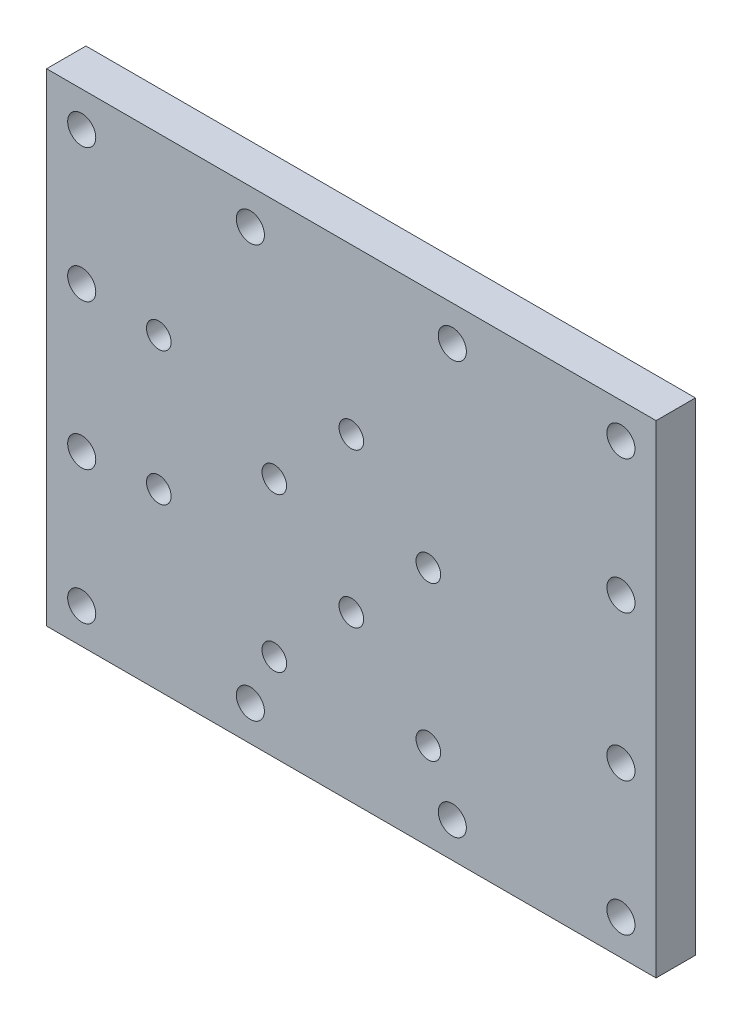
ISO-10303-21;
HEADER;
FILE_DESCRIPTION(('STEP AP214'),'2;1');
FILE_NAME('part.step','',(''),(''),'','','');
FILE_SCHEMA(('AUTOMOTIVE_DESIGN { 1 0 10303 214 1 1 1 1 }'));
ENDSEC;
DATA;
#1=APPLICATION_CONTEXT('core data for automotive mechanical design processes');
#2=APPLICATION_PROTOCOL_DEFINITION('international standard','automotive_design',2000,#1);
#3=PRODUCT_CONTEXT('',#1,'mechanical');
#4=PRODUCT('Part','Part','',(#3));
#5=PRODUCT_RELATED_PRODUCT_CATEGORY('part','',(#4));
#6=PRODUCT_DEFINITION_FORMATION('','',#4);
#7=PRODUCT_DEFINITION_CONTEXT('part definition',#1,'design');
#8=PRODUCT_DEFINITION('design','',#6,#7);
#9=PRODUCT_DEFINITION_SHAPE('','',#8);
#10=(LENGTH_UNIT() NAMED_UNIT(*) SI_UNIT(.MILLI.,.METRE.));
#11=(NAMED_UNIT(*) PLANE_ANGLE_UNIT() SI_UNIT($,.RADIAN.));
#12=(NAMED_UNIT(*) SI_UNIT($,.STERADIAN.) SOLID_ANGLE_UNIT());
#13=UNCERTAINTY_MEASURE_WITH_UNIT(LENGTH_MEASURE(1.E-05),#10,'distance_accuracy_value','');
#14=(GEOMETRIC_REPRESENTATION_CONTEXT(3) GLOBAL_UNCERTAINTY_ASSIGNED_CONTEXT((#13)) GLOBAL_UNIT_ASSIGNED_CONTEXT((#10,
#11,#12)) REPRESENTATION_CONTEXT('',''));
#15=CARTESIAN_POINT('',(0.,0.,0.));
#16=DIRECTION('',(0.,0.,1.));
#17=DIRECTION('',(1.,0.,0.));
#18=AXIS2_PLACEMENT_3D('',#15,#16,#17);
#19=CARTESIAN_POINT('',(0.,0.,3.08959499710472));
#20=DIRECTION('',(0.,0.,-1.));
#21=DIRECTION('',(-1.,0.,0.));
#22=AXIS2_PLACEMENT_3D('',#19,#20,#21);
#23=PLANE('',#22);
#24=CARTESIAN_POINT('',(-112.854312824647,49.0731544247676,3.08959499710472));
#25=DIRECTION('',(0.,0.,1.));
#26=DIRECTION('',(1.,0.,0.));
#27=AXIS2_PLACEMENT_3D('',#24,#25,#26);
#28=CIRCLE('',#27,1.75);
#29=CARTESIAN_POINT('',(-111.104312824647,49.0731544247676,3.08959499710472));
#30=VERTEX_POINT('',#29);
#31=EDGE_CURVE('E223',#30,#30,#28,.T.);
#32=ORIENTED_EDGE('',*,*,#31,.F.);
#33=EDGE_LOOP('',(#32));
#34=FACE_BOUND('',#33,.T.);
#35=CARTESIAN_POINT('',(-90.9343128246472,49.0731544247676,3.08959499710472));
#36=DIRECTION('',(0.,0.,1.));
#37=DIRECTION('',(1.,0.,0.));
#38=AXIS2_PLACEMENT_3D('',#35,#36,#37);
#39=CIRCLE('',#38,1.75);
#40=CARTESIAN_POINT('',(-89.1843128246472,49.0731544247676,3.08959499710472));
#41=VERTEX_POINT('',#40);
#42=EDGE_CURVE('E217',#41,#41,#39,.T.);
#43=ORIENTED_EDGE('',*,*,#42,.F.);
#44=EDGE_LOOP('',(#43));
#45=FACE_BOUND('',#44,.T.);
#46=CARTESIAN_POINT('',(-101.894312824647,81.9531544247676,3.08959499710472));
#47=DIRECTION('',(0.,0.,1.));
#48=DIRECTION('',(1.,0.,0.));
#49=AXIS2_PLACEMENT_3D('',#46,#47,#48);
#50=CIRCLE('',#49,1.75);
#51=CARTESIAN_POINT('',(-100.144312824647,81.9531544247676,3.08959499710472));
#52=VERTEX_POINT('',#51);
#53=EDGE_CURVE('E211',#52,#52,#50,.T.);
#54=ORIENTED_EDGE('',*,*,#53,.F.);
#55=EDGE_LOOP('',(#54));
#56=FACE_BOUND('',#55,.T.);
#57=CARTESIAN_POINT('',(-90.9343128246472,70.9931544247678,3.08959499710472));
#58=DIRECTION('',(0.,0.,1.));
#59=DIRECTION('',(1.,0.,0.));
#60=AXIS2_PLACEMENT_3D('',#57,#58,#59);
#61=CIRCLE('',#60,1.75);
#62=CARTESIAN_POINT('',(-89.1843128246472,70.9931544247678,3.08959499710472));
#63=VERTEX_POINT('',#62);
#64=EDGE_CURVE('E205',#63,#63,#61,.T.);
#65=ORIENTED_EDGE('',*,*,#64,.F.);
#66=EDGE_LOOP('',(#65));
#67=FACE_BOUND('',#66,.T.);
#68=CARTESIAN_POINT('',(-101.894312824647,60.0331544247676,3.08959499710472));
#69=DIRECTION('',(0.,0.,1.));
#70=DIRECTION('',(1.,0.,0.));
#71=AXIS2_PLACEMENT_3D('',#68,#69,#70);
#72=CIRCLE('',#71,1.75);
#73=CARTESIAN_POINT('',(-100.144312824647,60.0331544247676,3.08959499710472));
#74=VERTEX_POINT('',#73);
#75=EDGE_CURVE('E199',#74,#74,#72,.T.);
#76=ORIENTED_EDGE('',*,*,#75,.F.);
#77=EDGE_LOOP('',(#76));
#78=FACE_BOUND('',#77,.T.);
#79=CARTESIAN_POINT('',(-112.854312824647,70.9931544247678,3.08959499710472));
#80=DIRECTION('',(0.,0.,1.));
#81=DIRECTION('',(1.,0.,0.));
#82=AXIS2_PLACEMENT_3D('',#79,#80,#81);
#83=CIRCLE('',#82,1.75);
#84=CARTESIAN_POINT('',(-111.104312824647,70.9931544247678,3.08959499710472));
#85=VERTEX_POINT('',#84);
#86=EDGE_CURVE('E193',#85,#85,#83,.T.);
#87=ORIENTED_EDGE('',*,*,#86,.F.);
#88=EDGE_LOOP('',(#87));
#89=FACE_BOUND('',#88,.T.);
#90=CARTESIAN_POINT('',(-129.295243468411,61.5009786918622,3.08959499710472));
#91=DIRECTION('',(0.,0.,1.));
#92=DIRECTION('',(1.,0.,0.));
#93=AXIS2_PLACEMENT_3D('',#90,#91,#92);
#94=CIRCLE('',#93,1.75000000000001);
#95=CARTESIAN_POINT('',(-127.545243468411,61.5009786918622,3.08959499710472));
#96=VERTEX_POINT('',#95);
#97=EDGE_CURVE('E187',#96,#96,#94,.T.);
#98=ORIENTED_EDGE('',*,*,#97,.F.);
#99=EDGE_LOOP('',(#98));
#100=FACE_BOUND('',#99,.T.);
#101=CARTESIAN_POINT('',(-129.295243468411,80.4853301576721,3.08959499710472));
#102=DIRECTION('',(0.,0.,1.));
#103=DIRECTION('',(1.,0.,0.));
#104=AXIS2_PLACEMENT_3D('',#101,#102,#103);
#105=CIRCLE('',#104,1.75000000000001);
#106=CARTESIAN_POINT('',(-127.545243468411,80.4853301576721,3.08959499710472));
#107=VERTEX_POINT('',#106);
#108=EDGE_CURVE('E181',#107,#107,#105,.T.);
#109=ORIENTED_EDGE('',*,*,#108,.F.);
#110=EDGE_LOOP('',(#109));
#111=FACE_BOUND('',#110,.T.);
#112=CARTESIAN_POINT('',(-116.264312824647,100.341954424767,3.08959499710472));
#113=DIRECTION('',(0.,0.,1.));
#114=DIRECTION('',(1.,0.,0.));
#115=AXIS2_PLACEMENT_3D('',#112,#113,#114);
#116=CIRCLE('',#115,2.);
#117=CARTESIAN_POINT('',(-114.264312824647,100.341954424767,3.08959499710472));
#118=VERTEX_POINT('',#117);
#119=EDGE_CURVE('E169',#118,#118,#116,.T.);
#120=ORIENTED_EDGE('',*,*,#119,.F.);
#121=EDGE_LOOP('',(#120));
#122=FACE_BOUND('',#121,.T.);
#123=CARTESIAN_POINT('',(-140.264312824647,81.3419544247674,3.08959499710472));
#124=DIRECTION('',(0.,0.,1.));
#125=DIRECTION('',(1.,0.,0.));
#126=AXIS2_PLACEMENT_3D('',#123,#124,#125);
#127=CIRCLE('',#126,2.);
#128=CARTESIAN_POINT('',(-138.264312824647,81.3419544247674,3.08959499710472));
#129=VERTEX_POINT('',#128);
#130=EDGE_CURVE('E157',#129,#129,#127,.T.);
#131=ORIENTED_EDGE('',*,*,#130,.F.);
#132=EDGE_LOOP('',(#131));
#133=FACE_BOUND('',#132,.T.);
#134=CARTESIAN_POINT('',(-140.264312824647,41.6443544247679,3.08959499710472));
#135=DIRECTION('',(0.,0.,1.));
#136=DIRECTION('',(1.,0.,0.));
#137=AXIS2_PLACEMENT_3D('',#134,#135,#136);
#138=CIRCLE('',#137,2.);
#139=CARTESIAN_POINT('',(-138.264312824647,41.6443544247679,3.08959499710472));
#140=VERTEX_POINT('',#139);
#141=EDGE_CURVE('E145',#140,#140,#138,.T.);
#142=ORIENTED_EDGE('',*,*,#141,.F.);
#143=EDGE_LOOP('',(#142));
#144=FACE_BOUND('',#143,.T.);
#145=CARTESIAN_POINT('',(-87.5243128246472,41.6443544247679,3.08959499710472));
#146=DIRECTION('',(0.,0.,1.));
#147=DIRECTION('',(1.,0.,0.));
#148=AXIS2_PLACEMENT_3D('',#145,#146,#147);
#149=CIRCLE('',#148,2.);
#150=CARTESIAN_POINT('',(-85.5243128246472,41.6443544247679,3.08959499710472));
#151=VERTEX_POINT('',#150);
#152=EDGE_CURVE('E133',#151,#151,#149,.T.);
#153=ORIENTED_EDGE('',*,*,#152,.F.);
#154=EDGE_LOOP('',(#153));
#155=FACE_BOUND('',#154,.T.);
#156=CARTESIAN_POINT('',(-63.5243128246471,60.6443544247679,3.08959499710472));
#157=DIRECTION('',(0.,0.,1.));
#158=DIRECTION('',(1.,0.,0.));
#159=AXIS2_PLACEMENT_3D('',#156,#157,#158);
#160=CIRCLE('',#159,2.);
#161=CARTESIAN_POINT('',(-61.5243128246471,60.6443544247679,3.08959499710472));
#162=VERTEX_POINT('',#161);
#163=EDGE_CURVE('E121',#162,#162,#160,.T.);
#164=ORIENTED_EDGE('',*,*,#163,.F.);
#165=EDGE_LOOP('',(#164));
#166=FACE_BOUND('',#165,.T.);
#167=CARTESIAN_POINT('',(-63.5243128246472,100.341954424767,3.08959499710472));
#168=DIRECTION('',(0.,0.,1.));
#169=DIRECTION('',(1.,0.,0.));
#170=AXIS2_PLACEMENT_3D('',#167,#168,#169);
#171=CIRCLE('',#170,2.);
#172=CARTESIAN_POINT('',(-61.5243128246472,100.341954424767,3.08959499710472));
#173=VERTEX_POINT('',#172);
#174=EDGE_CURVE('E100',#173,#173,#171,.T.);
#175=ORIENTED_EDGE('',*,*,#174,.F.);
#176=EDGE_LOOP('',(#175));
#177=FACE_BOUND('',#176,.T.);
#178=DIRECTION('',(0.,-1.,0.));
#179=VECTOR('',#178,1.);
#180=CARTESIAN_POINT('',(-145.264312824647,36.6443544247679,3.08959499710472));
#181=LINE('',#180,#179);
#182=CARTESIAN_POINT('',(-145.264312824647,105.341954424767,3.08959499710472));
#183=VERTEX_POINT('',#182);
#184=CARTESIAN_POINT('',(-145.264312824647,36.6443544247679,3.08959499710472));
#185=VERTEX_POINT('',#184);
#186=EDGE_CURVE('E85',#183,#185,#181,.T.);
#187=ORIENTED_EDGE('',*,*,#186,.T.);
#188=DIRECTION('',(1.,0.,0.));
#189=VECTOR('',#188,1.);
#190=CARTESIAN_POINT('',(-145.264312824647,36.6443544247679,3.08959499710472));
#191=LINE('',#190,#189);
#192=CARTESIAN_POINT('',(-58.5243128246472,36.6443544247679,3.08959499710472));
#193=VERTEX_POINT('',#192);
#194=EDGE_CURVE('E80',#185,#193,#191,.T.);
#195=ORIENTED_EDGE('',*,*,#194,.T.);
#196=DIRECTION('',(0.,1.,0.));
#197=VECTOR('',#196,1.);
#198=CARTESIAN_POINT('',(-58.5243128246472,36.6443544247679,3.08959499710472));
#199=LINE('',#198,#197);
#200=CARTESIAN_POINT('',(-58.5243128246472,105.341954424767,3.08959499710472));
#201=VERTEX_POINT('',#200);
#202=EDGE_CURVE('E83',#193,#201,#199,.T.);
#203=ORIENTED_EDGE('',*,*,#202,.T.);
#204=DIRECTION('',(-1.,0.,0.));
#205=VECTOR('',#204,1.);
#206=CARTESIAN_POINT('',(-145.264312824647,105.341954424767,3.08959499710472));
#207=LINE('',#206,#205);
#208=EDGE_CURVE('E50',#201,#183,#207,.T.);
#209=ORIENTED_EDGE('',*,*,#208,.T.);
#210=EDGE_LOOP('',(#187,#195,#203,#209));
#211=FACE_BOUND('',#210,.T.);
#212=CARTESIAN_POINT('',(-63.5243128246471,81.3419544247674,3.08959499710472));
#213=DIRECTION('',(0.,0.,1.));
#214=DIRECTION('',(1.,0.,0.));
#215=AXIS2_PLACEMENT_3D('',#212,#213,#214);
#216=CIRCLE('',#215,2.);
#217=CARTESIAN_POINT('',(-61.5243128246471,81.3419544247674,3.08959499710472));
#218=VERTEX_POINT('',#217);
#219=EDGE_CURVE('E115',#218,#218,#216,.T.);
#220=ORIENTED_EDGE('',*,*,#219,.F.);
#221=EDGE_LOOP('',(#220));
#222=FACE_BOUND('',#221,.T.);
#223=CARTESIAN_POINT('',(-63.5243128246472,41.6443544247679,3.08959499710472));
#224=DIRECTION('',(0.,0.,1.));
#225=DIRECTION('',(1.,0.,0.));
#226=AXIS2_PLACEMENT_3D('',#223,#224,#225);
#227=CIRCLE('',#226,2.);
#228=CARTESIAN_POINT('',(-61.5243128246472,41.6443544247679,3.08959499710472));
#229=VERTEX_POINT('',#228);
#230=EDGE_CURVE('E127',#229,#229,#227,.T.);
#231=ORIENTED_EDGE('',*,*,#230,.F.);
#232=EDGE_LOOP('',(#231));
#233=FACE_BOUND('',#232,.T.);
#234=CARTESIAN_POINT('',(-116.264312824647,41.6443544247679,3.08959499710472));
#235=DIRECTION('',(0.,0.,1.));
#236=DIRECTION('',(1.,0.,0.));
#237=AXIS2_PLACEMENT_3D('',#234,#235,#236);
#238=CIRCLE('',#237,2.);
#239=CARTESIAN_POINT('',(-114.264312824647,41.6443544247679,3.08959499710472));
#240=VERTEX_POINT('',#239);
#241=EDGE_CURVE('E139',#240,#240,#238,.T.);
#242=ORIENTED_EDGE('',*,*,#241,.F.);
#243=EDGE_LOOP('',(#242));
#244=FACE_BOUND('',#243,.T.);
#245=CARTESIAN_POINT('',(-140.264312824647,60.6443544247679,3.08959499710472));
#246=DIRECTION('',(0.,0.,1.));
#247=DIRECTION('',(1.,0.,0.));
#248=AXIS2_PLACEMENT_3D('',#245,#246,#247);
#249=CIRCLE('',#248,2.);
#250=CARTESIAN_POINT('',(-138.264312824647,60.6443544247679,3.08959499710472));
#251=VERTEX_POINT('',#250);
#252=EDGE_CURVE('E151',#251,#251,#249,.T.);
#253=ORIENTED_EDGE('',*,*,#252,.F.);
#254=EDGE_LOOP('',(#253));
#255=FACE_BOUND('',#254,.T.);
#256=CARTESIAN_POINT('',(-140.264312824647,100.341954424767,3.08959499710472));
#257=DIRECTION('',(0.,0.,1.));
#258=DIRECTION('',(1.,0.,0.));
#259=AXIS2_PLACEMENT_3D('',#256,#257,#258);
#260=CIRCLE('',#259,2.);
#261=CARTESIAN_POINT('',(-138.264312824647,100.341954424767,3.08959499710472));
#262=VERTEX_POINT('',#261);
#263=EDGE_CURVE('E163',#262,#262,#260,.T.);
#264=ORIENTED_EDGE('',*,*,#263,.F.);
#265=EDGE_LOOP('',(#264));
#266=FACE_BOUND('',#265,.T.);
#267=CARTESIAN_POINT('',(-87.5243128246472,100.341954424767,3.08959499710472));
#268=DIRECTION('',(0.,0.,1.));
#269=DIRECTION('',(1.,0.,0.));
#270=AXIS2_PLACEMENT_3D('',#267,#268,#269);
#271=CIRCLE('',#270,2.);
#272=CARTESIAN_POINT('',(-85.5243128246472,100.341954424767,3.08959499710472));
#273=VERTEX_POINT('',#272);
#274=EDGE_CURVE('E175',#273,#273,#271,.T.);
#275=ORIENTED_EDGE('',*,*,#274,.F.);
#276=EDGE_LOOP('',(#275));
#277=FACE_BOUND('',#276,.T.);
#278=ADVANCED_FACE('F33',(#34,#45,#56,#67,#78,#89,#100,#111,#122,#133,#144,#155,#166,#177,#211,
#222,#233,#244,#255,#266,#277),#23,.F.);
#279=CARTESIAN_POINT('',(0.,0.,-2.51040500289528));
#280=DIRECTION('',(0.,0.,-1.));
#281=DIRECTION('',(-1.,0.,0.));
#282=AXIS2_PLACEMENT_3D('',#279,#280,#281);
#283=PLANE('',#282);
#284=CARTESIAN_POINT('',(-112.854312824647,49.0731544247676,-2.51040500289528));
#285=DIRECTION('',(0.,0.,-1.));
#286=DIRECTION('',(-1.,0.,0.));
#287=AXIS2_PLACEMENT_3D('',#284,#285,#286);
#288=CIRCLE('',#287,1.75);
#289=CARTESIAN_POINT('',(-114.604312824647,49.0731544247676,-2.51040500289528));
#290=VERTEX_POINT('',#289);
#291=EDGE_CURVE('E226',#290,#290,#288,.F.);
#292=ORIENTED_EDGE('',*,*,#291,.T.);
#293=EDGE_LOOP('',(#292));
#294=FACE_BOUND('',#293,.T.);
#295=CARTESIAN_POINT('',(-90.9343128246472,49.0731544247676,-2.51040500289528));
#296=DIRECTION('',(0.,0.,-1.));
#297=DIRECTION('',(-1.,0.,0.));
#298=AXIS2_PLACEMENT_3D('',#295,#296,#297);
#299=CIRCLE('',#298,1.75);
#300=CARTESIAN_POINT('',(-92.6843128246472,49.0731544247676,-2.51040500289528));
#301=VERTEX_POINT('',#300);
#302=EDGE_CURVE('E220',#301,#301,#299,.F.);
#303=ORIENTED_EDGE('',*,*,#302,.T.);
#304=EDGE_LOOP('',(#303));
#305=FACE_BOUND('',#304,.T.);
#306=CARTESIAN_POINT('',(-101.894312824647,81.9531544247676,-2.51040500289528));
#307=DIRECTION('',(0.,0.,-1.));
#308=DIRECTION('',(-1.,0.,0.));
#309=AXIS2_PLACEMENT_3D('',#306,#307,#308);
#310=CIRCLE('',#309,1.75);
#311=CARTESIAN_POINT('',(-103.644312824647,81.9531544247676,-2.51040500289528));
#312=VERTEX_POINT('',#311);
#313=EDGE_CURVE('E214',#312,#312,#310,.F.);
#314=ORIENTED_EDGE('',*,*,#313,.T.);
#315=EDGE_LOOP('',(#314));
#316=FACE_BOUND('',#315,.T.);
#317=CARTESIAN_POINT('',(-90.9343128246472,70.9931544247678,-2.51040500289528));
#318=DIRECTION('',(0.,0.,-1.));
#319=DIRECTION('',(-1.,0.,0.));
#320=AXIS2_PLACEMENT_3D('',#317,#318,#319);
#321=CIRCLE('',#320,1.75);
#322=CARTESIAN_POINT('',(-92.6843128246472,70.9931544247678,-2.51040500289528));
#323=VERTEX_POINT('',#322);
#324=EDGE_CURVE('E208',#323,#323,#321,.F.);
#325=ORIENTED_EDGE('',*,*,#324,.T.);
#326=EDGE_LOOP('',(#325));
#327=FACE_BOUND('',#326,.T.);
#328=CARTESIAN_POINT('',(-101.894312824647,60.0331544247676,-2.51040500289528));
#329=DIRECTION('',(0.,0.,-1.));
#330=DIRECTION('',(-1.,0.,0.));
#331=AXIS2_PLACEMENT_3D('',#328,#329,#330);
#332=CIRCLE('',#331,1.75);
#333=CARTESIAN_POINT('',(-103.644312824647,60.0331544247676,-2.51040500289528));
#334=VERTEX_POINT('',#333);
#335=EDGE_CURVE('E202',#334,#334,#332,.F.);
#336=ORIENTED_EDGE('',*,*,#335,.T.);
#337=EDGE_LOOP('',(#336));
#338=FACE_BOUND('',#337,.T.);
#339=CARTESIAN_POINT('',(-112.854312824647,70.9931544247678,-2.51040500289528));
#340=DIRECTION('',(0.,0.,-1.));
#341=DIRECTION('',(-1.,0.,0.));
#342=AXIS2_PLACEMENT_3D('',#339,#340,#341);
#343=CIRCLE('',#342,1.75);
#344=CARTESIAN_POINT('',(-114.604312824647,70.9931544247678,-2.51040500289528));
#345=VERTEX_POINT('',#344);
#346=EDGE_CURVE('E196',#345,#345,#343,.F.);
#347=ORIENTED_EDGE('',*,*,#346,.T.);
#348=EDGE_LOOP('',(#347));
#349=FACE_BOUND('',#348,.T.);
#350=CARTESIAN_POINT('',(-129.295243468411,61.5009786918622,-2.51040500289528));
#351=DIRECTION('',(0.,0.,-1.));
#352=DIRECTION('',(-1.,0.,0.));
#353=AXIS2_PLACEMENT_3D('',#350,#351,#352);
#354=CIRCLE('',#353,1.75000000000001);
#355=CARTESIAN_POINT('',(-131.045243468411,61.5009786918622,-2.51040500289528));
#356=VERTEX_POINT('',#355);
#357=EDGE_CURVE('E190',#356,#356,#354,.F.);
#358=ORIENTED_EDGE('',*,*,#357,.T.);
#359=EDGE_LOOP('',(#358));
#360=FACE_BOUND('',#359,.T.);
#361=CARTESIAN_POINT('',(-129.295243468411,80.4853301576721,-2.51040500289528));
#362=DIRECTION('',(0.,0.,-1.));
#363=DIRECTION('',(-1.,0.,0.));
#364=AXIS2_PLACEMENT_3D('',#361,#362,#363);
#365=CIRCLE('',#364,1.75000000000001);
#366=CARTESIAN_POINT('',(-131.045243468411,80.4853301576721,-2.51040500289528));
#367=VERTEX_POINT('',#366);
#368=EDGE_CURVE('E184',#367,#367,#365,.F.);
#369=ORIENTED_EDGE('',*,*,#368,.T.);
#370=EDGE_LOOP('',(#369));
#371=FACE_BOUND('',#370,.T.);
#372=CARTESIAN_POINT('',(-116.264312824647,100.341954424767,-2.51040500289528));
#373=DIRECTION('',(0.,0.,1.));
#374=DIRECTION('',(1.,0.,0.));
#375=AXIS2_PLACEMENT_3D('',#372,#373,#374);
#376=CIRCLE('',#375,2.);
#377=CARTESIAN_POINT('',(-114.264312824647,100.341954424767,-2.51040500289528));
#378=VERTEX_POINT('',#377);
#379=EDGE_CURVE('E172',#378,#378,#376,.T.);
#380=ORIENTED_EDGE('',*,*,#379,.T.);
#381=EDGE_LOOP('',(#380));
#382=FACE_BOUND('',#381,.T.);
#383=CARTESIAN_POINT('',(-140.264312824647,81.3419544247674,-2.51040500289528));
#384=DIRECTION('',(0.,0.,1.));
#385=DIRECTION('',(1.,0.,0.));
#386=AXIS2_PLACEMENT_3D('',#383,#384,#385);
#387=CIRCLE('',#386,2.);
#388=CARTESIAN_POINT('',(-138.264312824647,81.3419544247674,-2.51040500289528));
#389=VERTEX_POINT('',#388);
#390=EDGE_CURVE('E160',#389,#389,#387,.T.);
#391=ORIENTED_EDGE('',*,*,#390,.T.);
#392=EDGE_LOOP('',(#391));
#393=FACE_BOUND('',#392,.T.);
#394=CARTESIAN_POINT('',(-140.264312824647,41.6443544247679,-2.51040500289528));
#395=DIRECTION('',(0.,0.,1.));
#396=DIRECTION('',(1.,0.,0.));
#397=AXIS2_PLACEMENT_3D('',#394,#395,#396);
#398=CIRCLE('',#397,2.);
#399=CARTESIAN_POINT('',(-138.264312824647,41.6443544247679,-2.51040500289528));
#400=VERTEX_POINT('',#399);
#401=EDGE_CURVE('E148',#400,#400,#398,.T.);
#402=ORIENTED_EDGE('',*,*,#401,.T.);
#403=EDGE_LOOP('',(#402));
#404=FACE_BOUND('',#403,.T.);
#405=CARTESIAN_POINT('',(-87.5243128246472,41.6443544247679,-2.51040500289528));
#406=DIRECTION('',(0.,0.,1.));
#407=DIRECTION('',(1.,0.,0.));
#408=AXIS2_PLACEMENT_3D('',#405,#406,#407);
#409=CIRCLE('',#408,2.);
#410=CARTESIAN_POINT('',(-85.5243128246472,41.6443544247679,-2.51040500289528));
#411=VERTEX_POINT('',#410);
#412=EDGE_CURVE('E136',#411,#411,#409,.T.);
#413=ORIENTED_EDGE('',*,*,#412,.T.);
#414=EDGE_LOOP('',(#413));
#415=FACE_BOUND('',#414,.T.);
#416=CARTESIAN_POINT('',(-63.5243128246471,60.6443544247679,-2.51040500289528));
#417=DIRECTION('',(0.,0.,1.));
#418=DIRECTION('',(1.,0.,0.));
#419=AXIS2_PLACEMENT_3D('',#416,#417,#418);
#420=CIRCLE('',#419,2.);
#421=CARTESIAN_POINT('',(-61.5243128246471,60.6443544247679,-2.51040500289528));
#422=VERTEX_POINT('',#421);
#423=EDGE_CURVE('E124',#422,#422,#420,.T.);
#424=ORIENTED_EDGE('',*,*,#423,.T.);
#425=EDGE_LOOP('',(#424));
#426=FACE_BOUND('',#425,.T.);
#427=CARTESIAN_POINT('',(-63.5243128246472,100.341954424767,-2.51040500289528));
#428=DIRECTION('',(0.,0.,1.));
#429=DIRECTION('',(1.,0.,0.));
#430=AXIS2_PLACEMENT_3D('',#427,#428,#429);
#431=CIRCLE('',#430,2.);
#432=CARTESIAN_POINT('',(-61.5243128246472,100.341954424767,-2.51040500289528));
#433=VERTEX_POINT('',#432);
#434=EDGE_CURVE('E112',#433,#433,#431,.T.);
#435=ORIENTED_EDGE('',*,*,#434,.T.);
#436=EDGE_LOOP('',(#435));
#437=FACE_BOUND('',#436,.T.);
#438=DIRECTION('',(0.,-1.,0.));
#439=VECTOR('',#438,1.);
#440=CARTESIAN_POINT('',(-145.264312824647,36.6443544247679,-2.51040500289528));
#441=LINE('',#440,#439);
#442=CARTESIAN_POINT('',(-145.264312824647,105.341954424767,-2.51040500289528));
#443=VERTEX_POINT('',#442);
#444=CARTESIAN_POINT('',(-145.264312824647,36.6443544247679,-2.51040500289528));
#445=VERTEX_POINT('',#444);
#446=EDGE_CURVE('E97',#443,#445,#441,.T.);
#447=ORIENTED_EDGE('',*,*,#446,.F.);
#448=DIRECTION('',(-1.,0.,0.));
#449=VECTOR('',#448,1.);
#450=CARTESIAN_POINT('',(-145.264312824647,105.341954424767,-2.51040500289528));
#451=LINE('',#450,#449);
#452=CARTESIAN_POINT('',(-58.5243128246472,105.341954424767,-2.51040500289528));
#453=VERTEX_POINT('',#452);
#454=EDGE_CURVE('E73',#453,#443,#451,.T.);
#455=ORIENTED_EDGE('',*,*,#454,.F.);
#456=DIRECTION('',(0.,1.,0.));
#457=VECTOR('',#456,1.);
#458=CARTESIAN_POINT('',(-58.5243128246472,36.6443544247679,-2.51040500289528));
#459=LINE('',#458,#457);
#460=CARTESIAN_POINT('',(-58.5243128246472,36.6443544247679,-2.51040500289528));
#461=VERTEX_POINT('',#460);
#462=EDGE_CURVE('E67',#461,#453,#459,.T.);
#463=ORIENTED_EDGE('',*,*,#462,.F.);
#464=DIRECTION('',(1.,0.,0.));
#465=VECTOR('',#464,1.);
#466=CARTESIAN_POINT('',(-145.264312824647,36.6443544247679,-2.51040500289528));
#467=LINE('',#466,#465);
#468=EDGE_CURVE('E89',#445,#461,#467,.T.);
#469=ORIENTED_EDGE('',*,*,#468,.F.);
#470=EDGE_LOOP('',(#447,#455,#463,#469));
#471=FACE_BOUND('',#470,.T.);
#472=CARTESIAN_POINT('',(-63.5243128246471,81.3419544247674,-2.51040500289528));
#473=DIRECTION('',(0.,0.,1.));
#474=DIRECTION('',(1.,0.,0.));
#475=AXIS2_PLACEMENT_3D('',#472,#473,#474);
#476=CIRCLE('',#475,2.);
#477=CARTESIAN_POINT('',(-61.5243128246471,81.3419544247674,-2.51040500289528));
#478=VERTEX_POINT('',#477);
#479=EDGE_CURVE('E118',#478,#478,#476,.T.);
#480=ORIENTED_EDGE('',*,*,#479,.T.);
#481=EDGE_LOOP('',(#480));
#482=FACE_BOUND('',#481,.T.);
#483=CARTESIAN_POINT('',(-63.5243128246472,41.6443544247679,-2.51040500289528));
#484=DIRECTION('',(0.,0.,1.));
#485=DIRECTION('',(1.,0.,0.));
#486=AXIS2_PLACEMENT_3D('',#483,#484,#485);
#487=CIRCLE('',#486,2.);
#488=CARTESIAN_POINT('',(-61.5243128246472,41.6443544247679,-2.51040500289528));
#489=VERTEX_POINT('',#488);
#490=EDGE_CURVE('E130',#489,#489,#487,.T.);
#491=ORIENTED_EDGE('',*,*,#490,.T.);
#492=EDGE_LOOP('',(#491));
#493=FACE_BOUND('',#492,.T.);
#494=CARTESIAN_POINT('',(-116.264312824647,41.6443544247679,-2.51040500289528));
#495=DIRECTION('',(0.,0.,1.));
#496=DIRECTION('',(1.,0.,0.));
#497=AXIS2_PLACEMENT_3D('',#494,#495,#496);
#498=CIRCLE('',#497,2.);
#499=CARTESIAN_POINT('',(-114.264312824647,41.6443544247679,-2.51040500289528));
#500=VERTEX_POINT('',#499);
#501=EDGE_CURVE('E142',#500,#500,#498,.T.);
#502=ORIENTED_EDGE('',*,*,#501,.T.);
#503=EDGE_LOOP('',(#502));
#504=FACE_BOUND('',#503,.T.);
#505=CARTESIAN_POINT('',(-140.264312824647,60.6443544247679,-2.51040500289528));
#506=DIRECTION('',(0.,0.,1.));
#507=DIRECTION('',(1.,0.,0.));
#508=AXIS2_PLACEMENT_3D('',#505,#506,#507);
#509=CIRCLE('',#508,2.);
#510=CARTESIAN_POINT('',(-138.264312824647,60.6443544247679,-2.51040500289528));
#511=VERTEX_POINT('',#510);
#512=EDGE_CURVE('E154',#511,#511,#509,.T.);
#513=ORIENTED_EDGE('',*,*,#512,.T.);
#514=EDGE_LOOP('',(#513));
#515=FACE_BOUND('',#514,.T.);
#516=CARTESIAN_POINT('',(-140.264312824647,100.341954424767,-2.51040500289528));
#517=DIRECTION('',(0.,0.,1.));
#518=DIRECTION('',(1.,0.,0.));
#519=AXIS2_PLACEMENT_3D('',#516,#517,#518);
#520=CIRCLE('',#519,2.);
#521=CARTESIAN_POINT('',(-138.264312824647,100.341954424767,-2.51040500289528));
#522=VERTEX_POINT('',#521);
#523=EDGE_CURVE('E166',#522,#522,#520,.T.);
#524=ORIENTED_EDGE('',*,*,#523,.T.);
#525=EDGE_LOOP('',(#524));
#526=FACE_BOUND('',#525,.T.);
#527=CARTESIAN_POINT('',(-87.5243128246472,100.341954424767,-2.51040500289528));
#528=DIRECTION('',(0.,0.,1.));
#529=DIRECTION('',(1.,0.,0.));
#530=AXIS2_PLACEMENT_3D('',#527,#528,#529);
#531=CIRCLE('',#530,2.);
#532=CARTESIAN_POINT('',(-85.5243128246472,100.341954424767,-2.51040500289528));
#533=VERTEX_POINT('',#532);
#534=EDGE_CURVE('E178',#533,#533,#531,.T.);
#535=ORIENTED_EDGE('',*,*,#534,.T.);
#536=EDGE_LOOP('',(#535));
#537=FACE_BOUND('',#536,.T.);
#538=ADVANCED_FACE('F108',(#294,#305,#316,#327,#338,#349,#360,#371,#382,#393,#404,#415,#426,
#437,#471,#482,#493,#504,#515,#526,#537),#283,.T.);
#539=CARTESIAN_POINT('',(-145.264312824647,36.6443544247679,3.08959499710472));
#540=DIRECTION('',(1.,0.,0.));
#541=DIRECTION('',(0.,0.,-1.));
#542=AXIS2_PLACEMENT_3D('',#539,#540,#541);
#543=PLANE('',#542);
#544=ORIENTED_EDGE('',*,*,#446,.T.);
#545=DIRECTION('',(0.,0.,-1.));
#546=VECTOR('',#545,1.);
#547=CARTESIAN_POINT('',(-145.264312824647,36.6443544247679,3.08959499710472));
#548=LINE('',#547,#546);
#549=EDGE_CURVE('E11',#185,#445,#548,.T.);
#550=ORIENTED_EDGE('',*,*,#549,.F.);
#551=ORIENTED_EDGE('',*,*,#186,.F.);
#552=DIRECTION('',(0.,0.,-1.));
#553=VECTOR('',#552,1.);
#554=CARTESIAN_POINT('',(-145.264312824647,105.341954424767,3.08959499710472));
#555=LINE('',#554,#553);
#556=EDGE_CURVE('E93',#183,#443,#555,.T.);
#557=ORIENTED_EDGE('',*,*,#556,.T.);
#558=EDGE_LOOP('',(#544,#550,#551,#557));
#559=FACE_BOUND('',#558,.T.);
#560=ADVANCED_FACE('F35',(#559),#543,.F.);
#561=CARTESIAN_POINT('',(-145.264312824647,36.6443544247679,3.08959499710472));
#562=DIRECTION('',(0.,1.,0.));
#563=DIRECTION('',(0.,0.,1.));
#564=AXIS2_PLACEMENT_3D('',#561,#562,#563);
#565=PLANE('',#564);
#566=ORIENTED_EDGE('',*,*,#468,.T.);
#567=DIRECTION('',(0.,0.,-1.));
#568=VECTOR('',#567,1.);
#569=CARTESIAN_POINT('',(-58.5243128246472,36.6443544247679,3.08959499710472));
#570=LINE('',#569,#568);
#571=EDGE_CURVE('E42',#193,#461,#570,.T.);
#572=ORIENTED_EDGE('',*,*,#571,.F.);
#573=ORIENTED_EDGE('',*,*,#194,.F.);
#574=ORIENTED_EDGE('',*,*,#549,.T.);
#575=EDGE_LOOP('',(#566,#572,#573,#574));
#576=FACE_BOUND('',#575,.T.);
#577=ADVANCED_FACE('F88',(#576),#565,.F.);
#578=CARTESIAN_POINT('',(-58.5243128246472,36.6443544247679,3.08959499710472));
#579=DIRECTION('',(-1.,0.,0.));
#580=DIRECTION('',(0.,0.,1.));
#581=AXIS2_PLACEMENT_3D('',#578,#579,#580);
#582=PLANE('',#581);
#583=ORIENTED_EDGE('',*,*,#462,.T.);
#584=DIRECTION('',(0.,0.,-1.));
#585=VECTOR('',#584,1.);
#586=CARTESIAN_POINT('',(-58.5243128246472,105.341954424767,3.08959499710472));
#587=LINE('',#586,#585);
#588=EDGE_CURVE('E90',#201,#453,#587,.T.);
#589=ORIENTED_EDGE('',*,*,#588,.F.);
#590=ORIENTED_EDGE('',*,*,#202,.F.);
#591=ORIENTED_EDGE('',*,*,#571,.T.);
#592=EDGE_LOOP('',(#583,#589,#590,#591));
#593=FACE_BOUND('',#592,.T.);
#594=ADVANCED_FACE('F91',(#593),#582,.F.);
#595=CARTESIAN_POINT('',(-145.264312824647,105.341954424767,3.08959499710472));
#596=DIRECTION('',(0.,-1.,0.));
#597=DIRECTION('',(0.,0.,-1.));
#598=AXIS2_PLACEMENT_3D('',#595,#596,#597);
#599=PLANE('',#598);
#600=ORIENTED_EDGE('',*,*,#454,.T.);
#601=ORIENTED_EDGE('',*,*,#556,.F.);
#602=ORIENTED_EDGE('',*,*,#208,.F.);
#603=ORIENTED_EDGE('',*,*,#588,.T.);
#604=EDGE_LOOP('',(#600,#601,#602,#603));
#605=FACE_BOUND('',#604,.T.);
#606=ADVANCED_FACE('F105',(#605),#599,.F.);
#607=CARTESIAN_POINT('',(-63.5243128246472,100.341954424767,3.08959499710472));
#608=DIRECTION('',(0.,0.,-1.));
#609=DIRECTION('',(-1.,0.,0.));
#610=AXIS2_PLACEMENT_3D('',#607,#608,#609);
#611=CYLINDRICAL_SURFACE('',#610,2.);
#612=ORIENTED_EDGE('',*,*,#174,.T.);
#613=EDGE_LOOP('',(#612));
#614=FACE_BOUND('',#613,.T.);
#615=ORIENTED_EDGE('',*,*,#434,.F.);
#616=EDGE_LOOP('',(#615));
#617=FACE_BOUND('',#616,.T.);
#618=ADVANCED_FACE('F263',(#614,#617),#611,.F.);
#619=CARTESIAN_POINT('',(-63.5243128246471,81.3419544247674,3.08959499710472));
#620=DIRECTION('',(0.,0.,-1.));
#621=DIRECTION('',(-1.,0.,0.));
#622=AXIS2_PLACEMENT_3D('',#619,#620,#621);
#623=CYLINDRICAL_SURFACE('',#622,2.);
#624=ORIENTED_EDGE('',*,*,#219,.T.);
#625=EDGE_LOOP('',(#624));
#626=FACE_BOUND('',#625,.T.);
#627=ORIENTED_EDGE('',*,*,#479,.F.);
#628=EDGE_LOOP('',(#627));
#629=FACE_BOUND('',#628,.T.);
#630=ADVANCED_FACE('F266',(#626,#629),#623,.F.);
#631=CARTESIAN_POINT('',(-63.5243128246471,60.6443544247679,3.08959499710472));
#632=DIRECTION('',(0.,0.,-1.));
#633=DIRECTION('',(-1.,0.,0.));
#634=AXIS2_PLACEMENT_3D('',#631,#632,#633);
#635=CYLINDRICAL_SURFACE('',#634,2.);
#636=ORIENTED_EDGE('',*,*,#163,.T.);
#637=EDGE_LOOP('',(#636));
#638=FACE_BOUND('',#637,.T.);
#639=ORIENTED_EDGE('',*,*,#423,.F.);
#640=EDGE_LOOP('',(#639));
#641=FACE_BOUND('',#640,.T.);
#642=ADVANCED_FACE('F308',(#638,#641),#635,.F.);
#643=CARTESIAN_POINT('',(-63.5243128246472,41.6443544247679,3.08959499710472));
#644=DIRECTION('',(0.,0.,-1.));
#645=DIRECTION('',(-1.,0.,0.));
#646=AXIS2_PLACEMENT_3D('',#643,#644,#645);
#647=CYLINDRICAL_SURFACE('',#646,2.);
#648=ORIENTED_EDGE('',*,*,#230,.T.);
#649=EDGE_LOOP('',(#648));
#650=FACE_BOUND('',#649,.T.);
#651=ORIENTED_EDGE('',*,*,#490,.F.);
#652=EDGE_LOOP('',(#651));
#653=FACE_BOUND('',#652,.T.);
#654=ADVANCED_FACE('F317',(#650,#653),#647,.F.);
#655=CARTESIAN_POINT('',(-87.5243128246472,41.6443544247679,3.08959499710472));
#656=DIRECTION('',(0.,0.,-1.));
#657=DIRECTION('',(-1.,0.,0.));
#658=AXIS2_PLACEMENT_3D('',#655,#656,#657);
#659=CYLINDRICAL_SURFACE('',#658,2.);
#660=ORIENTED_EDGE('',*,*,#152,.T.);
#661=EDGE_LOOP('',(#660));
#662=FACE_BOUND('',#661,.T.);
#663=ORIENTED_EDGE('',*,*,#412,.F.);
#664=EDGE_LOOP('',(#663));
#665=FACE_BOUND('',#664,.T.);
#666=ADVANCED_FACE('F326',(#662,#665),#659,.F.);
#667=CARTESIAN_POINT('',(-116.264312824647,41.6443544247679,3.08959499710472));
#668=DIRECTION('',(0.,0.,-1.));
#669=DIRECTION('',(-1.,0.,0.));
#670=AXIS2_PLACEMENT_3D('',#667,#668,#669);
#671=CYLINDRICAL_SURFACE('',#670,2.);
#672=ORIENTED_EDGE('',*,*,#241,.T.);
#673=EDGE_LOOP('',(#672));
#674=FACE_BOUND('',#673,.T.);
#675=ORIENTED_EDGE('',*,*,#501,.F.);
#676=EDGE_LOOP('',(#675));
#677=FACE_BOUND('',#676,.T.);
#678=ADVANCED_FACE('F335',(#674,#677),#671,.F.);
#679=CARTESIAN_POINT('',(-140.264312824647,41.6443544247679,3.08959499710472));
#680=DIRECTION('',(0.,0.,-1.));
#681=DIRECTION('',(-1.,0.,0.));
#682=AXIS2_PLACEMENT_3D('',#679,#680,#681);
#683=CYLINDRICAL_SURFACE('',#682,2.);
#684=ORIENTED_EDGE('',*,*,#141,.T.);
#685=EDGE_LOOP('',(#684));
#686=FACE_BOUND('',#685,.T.);
#687=ORIENTED_EDGE('',*,*,#401,.F.);
#688=EDGE_LOOP('',(#687));
#689=FACE_BOUND('',#688,.T.);
#690=ADVANCED_FACE('F344',(#686,#689),#683,.F.);
#691=CARTESIAN_POINT('',(-140.264312824647,60.6443544247679,3.08959499710472));
#692=DIRECTION('',(0.,0.,-1.));
#693=DIRECTION('',(-1.,0.,0.));
#694=AXIS2_PLACEMENT_3D('',#691,#692,#693);
#695=CYLINDRICAL_SURFACE('',#694,2.);
#696=ORIENTED_EDGE('',*,*,#252,.T.);
#697=EDGE_LOOP('',(#696));
#698=FACE_BOUND('',#697,.T.);
#699=ORIENTED_EDGE('',*,*,#512,.F.);
#700=EDGE_LOOP('',(#699));
#701=FACE_BOUND('',#700,.T.);
#702=ADVANCED_FACE('F353',(#698,#701),#695,.F.);
#703=CARTESIAN_POINT('',(-140.264312824647,81.3419544247674,3.08959499710472));
#704=DIRECTION('',(0.,0.,-1.));
#705=DIRECTION('',(-1.,0.,0.));
#706=AXIS2_PLACEMENT_3D('',#703,#704,#705);
#707=CYLINDRICAL_SURFACE('',#706,2.);
#708=ORIENTED_EDGE('',*,*,#130,.T.);
#709=EDGE_LOOP('',(#708));
#710=FACE_BOUND('',#709,.T.);
#711=ORIENTED_EDGE('',*,*,#390,.F.);
#712=EDGE_LOOP('',(#711));
#713=FACE_BOUND('',#712,.T.);
#714=ADVANCED_FACE('F362',(#710,#713),#707,.F.);
#715=CARTESIAN_POINT('',(-140.264312824647,100.341954424767,3.08959499710472));
#716=DIRECTION('',(0.,0.,-1.));
#717=DIRECTION('',(-1.,0.,0.));
#718=AXIS2_PLACEMENT_3D('',#715,#716,#717);
#719=CYLINDRICAL_SURFACE('',#718,2.);
#720=ORIENTED_EDGE('',*,*,#263,.T.);
#721=EDGE_LOOP('',(#720));
#722=FACE_BOUND('',#721,.T.);
#723=ORIENTED_EDGE('',*,*,#523,.F.);
#724=EDGE_LOOP('',(#723));
#725=FACE_BOUND('',#724,.T.);
#726=ADVANCED_FACE('F371',(#722,#725),#719,.F.);
#727=CARTESIAN_POINT('',(-116.264312824647,100.341954424767,3.08959499710472));
#728=DIRECTION('',(0.,0.,-1.));
#729=DIRECTION('',(-1.,0.,0.));
#730=AXIS2_PLACEMENT_3D('',#727,#728,#729);
#731=CYLINDRICAL_SURFACE('',#730,2.);
#732=ORIENTED_EDGE('',*,*,#119,.T.);
#733=EDGE_LOOP('',(#732));
#734=FACE_BOUND('',#733,.T.);
#735=ORIENTED_EDGE('',*,*,#379,.F.);
#736=EDGE_LOOP('',(#735));
#737=FACE_BOUND('',#736,.T.);
#738=ADVANCED_FACE('F380',(#734,#737),#731,.F.);
#739=CARTESIAN_POINT('',(-87.5243128246472,100.341954424767,3.08959499710472));
#740=DIRECTION('',(0.,0.,-1.));
#741=DIRECTION('',(-1.,0.,0.));
#742=AXIS2_PLACEMENT_3D('',#739,#740,#741);
#743=CYLINDRICAL_SURFACE('',#742,2.);
#744=ORIENTED_EDGE('',*,*,#274,.T.);
#745=EDGE_LOOP('',(#744));
#746=FACE_BOUND('',#745,.T.);
#747=ORIENTED_EDGE('',*,*,#534,.F.);
#748=EDGE_LOOP('',(#747));
#749=FACE_BOUND('',#748,.T.);
#750=ADVANCED_FACE('F389',(#746,#749),#743,.F.);
#751=CARTESIAN_POINT('',(-129.295243468411,80.4853301576721,-11.1114050028953));
#752=DIRECTION('',(0.,0.,1.));
#753=DIRECTION('',(1.,0.,0.));
#754=AXIS2_PLACEMENT_3D('',#751,#752,#753);
#755=CYLINDRICAL_SURFACE('',#754,1.75000000000001);
#756=ORIENTED_EDGE('',*,*,#368,.F.);
#757=EDGE_LOOP('',(#756));
#758=FACE_BOUND('',#757,.T.);
#759=ORIENTED_EDGE('',*,*,#108,.T.);
#760=EDGE_LOOP('',(#759));
#761=FACE_BOUND('',#760,.T.);
#762=ADVANCED_FACE('F398',(#758,#761),#755,.F.);
#763=CARTESIAN_POINT('',(-129.295243468411,61.5009786918622,-11.1114050028953));
#764=DIRECTION('',(0.,0.,1.));
#765=DIRECTION('',(1.,0.,0.));
#766=AXIS2_PLACEMENT_3D('',#763,#764,#765);
#767=CYLINDRICAL_SURFACE('',#766,1.75000000000001);
#768=ORIENTED_EDGE('',*,*,#357,.F.);
#769=EDGE_LOOP('',(#768));
#770=FACE_BOUND('',#769,.T.);
#771=ORIENTED_EDGE('',*,*,#97,.T.);
#772=EDGE_LOOP('',(#771));
#773=FACE_BOUND('',#772,.T.);
#774=ADVANCED_FACE('F407',(#770,#773),#767,.F.);
#775=CARTESIAN_POINT('',(-112.854312824647,70.9931544247678,-11.1114050028953));
#776=DIRECTION('',(0.,0.,1.));
#777=DIRECTION('',(1.,0.,0.));
#778=AXIS2_PLACEMENT_3D('',#775,#776,#777);
#779=CYLINDRICAL_SURFACE('',#778,1.75);
#780=ORIENTED_EDGE('',*,*,#346,.F.);
#781=EDGE_LOOP('',(#780));
#782=FACE_BOUND('',#781,.T.);
#783=ORIENTED_EDGE('',*,*,#86,.T.);
#784=EDGE_LOOP('',(#783));
#785=FACE_BOUND('',#784,.T.);
#786=ADVANCED_FACE('F416',(#782,#785),#779,.F.);
#787=CARTESIAN_POINT('',(-101.894312824647,60.0331544247676,-11.1114050028953));
#788=DIRECTION('',(0.,0.,1.));
#789=DIRECTION('',(1.,0.,0.));
#790=AXIS2_PLACEMENT_3D('',#787,#788,#789);
#791=CYLINDRICAL_SURFACE('',#790,1.75);
#792=ORIENTED_EDGE('',*,*,#335,.F.);
#793=EDGE_LOOP('',(#792));
#794=FACE_BOUND('',#793,.T.);
#795=ORIENTED_EDGE('',*,*,#75,.T.);
#796=EDGE_LOOP('',(#795));
#797=FACE_BOUND('',#796,.T.);
#798=ADVANCED_FACE('F425',(#794,#797),#791,.F.);
#799=CARTESIAN_POINT('',(-90.9343128246472,70.9931544247678,-11.1114050028953));
#800=DIRECTION('',(0.,0.,1.));
#801=DIRECTION('',(1.,0.,0.));
#802=AXIS2_PLACEMENT_3D('',#799,#800,#801);
#803=CYLINDRICAL_SURFACE('',#802,1.75);
#804=ORIENTED_EDGE('',*,*,#324,.F.);
#805=EDGE_LOOP('',(#804));
#806=FACE_BOUND('',#805,.T.);
#807=ORIENTED_EDGE('',*,*,#64,.T.);
#808=EDGE_LOOP('',(#807));
#809=FACE_BOUND('',#808,.T.);
#810=ADVANCED_FACE('F434',(#806,#809),#803,.F.);
#811=CARTESIAN_POINT('',(-101.894312824647,81.9531544247676,-11.1114050028953));
#812=DIRECTION('',(0.,0.,1.));
#813=DIRECTION('',(1.,0.,0.));
#814=AXIS2_PLACEMENT_3D('',#811,#812,#813);
#815=CYLINDRICAL_SURFACE('',#814,1.75);
#816=ORIENTED_EDGE('',*,*,#313,.F.);
#817=EDGE_LOOP('',(#816));
#818=FACE_BOUND('',#817,.T.);
#819=ORIENTED_EDGE('',*,*,#53,.T.);
#820=EDGE_LOOP('',(#819));
#821=FACE_BOUND('',#820,.T.);
#822=ADVANCED_FACE('F443',(#818,#821),#815,.F.);
#823=CARTESIAN_POINT('',(-90.9343128246472,49.0731544247676,-11.1114050028953));
#824=DIRECTION('',(0.,0.,1.));
#825=DIRECTION('',(1.,0.,0.));
#826=AXIS2_PLACEMENT_3D('',#823,#824,#825);
#827=CYLINDRICAL_SURFACE('',#826,1.75);
#828=ORIENTED_EDGE('',*,*,#302,.F.);
#829=EDGE_LOOP('',(#828));
#830=FACE_BOUND('',#829,.T.);
#831=ORIENTED_EDGE('',*,*,#42,.T.);
#832=EDGE_LOOP('',(#831));
#833=FACE_BOUND('',#832,.T.);
#834=ADVANCED_FACE('F452',(#830,#833),#827,.F.);
#835=CARTESIAN_POINT('',(-112.854312824647,49.0731544247676,-11.1114050028953));
#836=DIRECTION('',(0.,0.,1.));
#837=DIRECTION('',(1.,0.,0.));
#838=AXIS2_PLACEMENT_3D('',#835,#836,#837);
#839=CYLINDRICAL_SURFACE('',#838,1.75);
#840=ORIENTED_EDGE('',*,*,#291,.F.);
#841=EDGE_LOOP('',(#840));
#842=FACE_BOUND('',#841,.T.);
#843=ORIENTED_EDGE('',*,*,#31,.T.);
#844=EDGE_LOOP('',(#843));
#845=FACE_BOUND('',#844,.T.);
#846=ADVANCED_FACE('F232',(#842,#845),#839,.F.);
#847=CLOSED_SHELL('',(#278,#538,#560,#577,#594,#606,#618,#630,#642,#654,#666,#678,#690,#702,
#714,#726,#738,#750,#762,#774,#786,#798,#810,#822,#834,#846));
#848=MANIFOLD_SOLID_BREP('B2',#847);
#849=ADVANCED_BREP_SHAPE_REPRESENTATION('',(#18,#848),#14);
#850=SHAPE_DEFINITION_REPRESENTATION(#9,#849);
ENDSEC;
END-ISO-10303-21;
